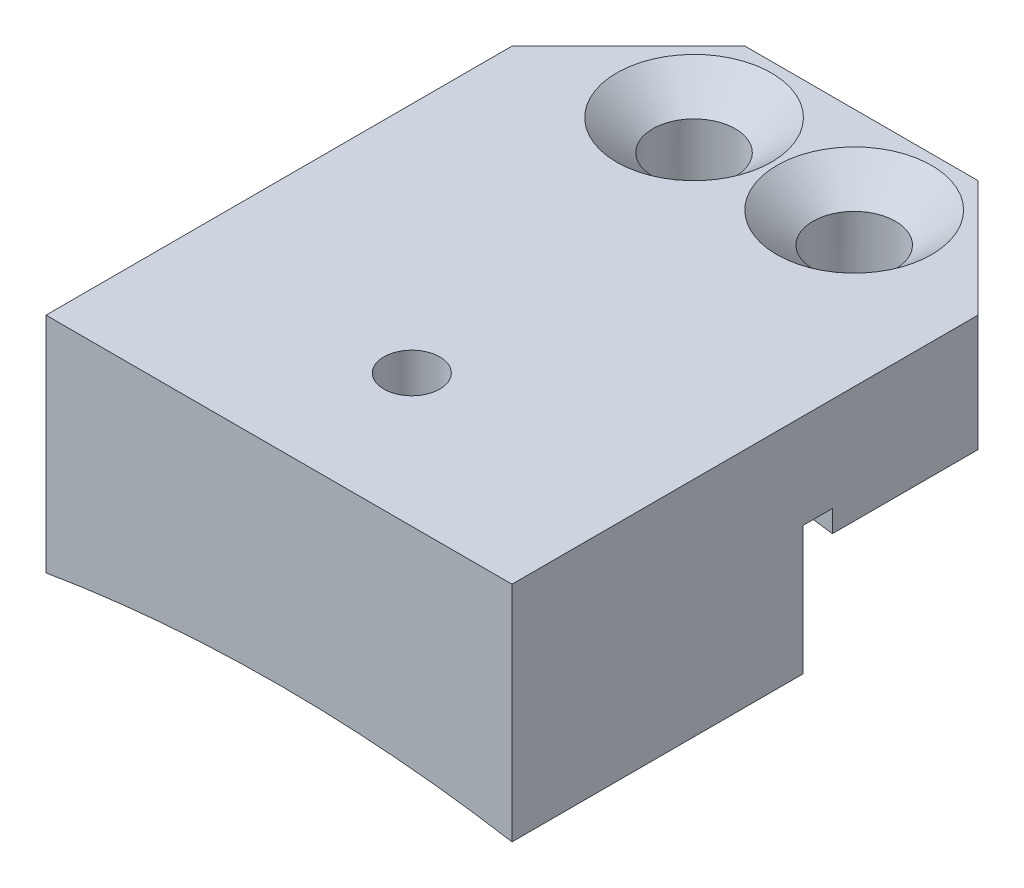
ISO-10303-21;
HEADER;
FILE_DESCRIPTION(('STEP AP214'),'2;1');
FILE_NAME('part.step','',(''),(''),'','','');
FILE_SCHEMA(('AUTOMOTIVE_DESIGN { 1 0 10303 214 1 1 1 1 }'));
ENDSEC;
DATA;
#1=APPLICATION_CONTEXT('core data for automotive mechanical design processes');
#2=APPLICATION_PROTOCOL_DEFINITION('international standard','automotive_design',2000,#1);
#3=PRODUCT_CONTEXT('',#1,'mechanical');
#4=PRODUCT('Part','Part','',(#3));
#5=PRODUCT_RELATED_PRODUCT_CATEGORY('part','',(#4));
#6=PRODUCT_DEFINITION_FORMATION('','',#4);
#7=PRODUCT_DEFINITION_CONTEXT('part definition',#1,'design');
#8=PRODUCT_DEFINITION('design','',#6,#7);
#9=PRODUCT_DEFINITION_SHAPE('','',#8);
#10=(LENGTH_UNIT() NAMED_UNIT(*) SI_UNIT(.MILLI.,.METRE.));
#11=(NAMED_UNIT(*) PLANE_ANGLE_UNIT() SI_UNIT($,.RADIAN.));
#12=(NAMED_UNIT(*) SI_UNIT($,.STERADIAN.) SOLID_ANGLE_UNIT());
#13=UNCERTAINTY_MEASURE_WITH_UNIT(LENGTH_MEASURE(1.E-05),#10,'distance_accuracy_value','');
#14=(GEOMETRIC_REPRESENTATION_CONTEXT(3) GLOBAL_UNCERTAINTY_ASSIGNED_CONTEXT((#13)) GLOBAL_UNIT_ASSIGNED_CONTEXT((#10,
#11,#12)) REPRESENTATION_CONTEXT('',''));
#15=CARTESIAN_POINT('',(0.,0.,0.));
#16=DIRECTION('',(0.,0.,1.));
#17=DIRECTION('',(1.,0.,0.));
#18=AXIS2_PLACEMENT_3D('',#15,#16,#17);
#19=CARTESIAN_POINT('',(-12.7,6.35,-15.875));
#20=DIRECTION('',(1.,0.,0.));
#21=DIRECTION('',(0.,0.,-1.));
#22=AXIS2_PLACEMENT_3D('',#19,#20,#21);
#23=PLANE('',#22);
#24=DIRECTION('',(0.,0.,1.));
#25=VECTOR('',#24,1.);
#26=CARTESIAN_POINT('',(-12.7,6.35,-15.875));
#27=LINE('',#26,#25);
#28=CARTESIAN_POINT('',(-12.7,6.35,-9.525));
#29=VERTEX_POINT('',#28);
#30=CARTESIAN_POINT('',(-12.7,6.35,15.875));
#31=VERTEX_POINT('',#30);
#32=EDGE_CURVE('E167',#29,#31,#27,.T.);
#33=ORIENTED_EDGE('',*,*,#32,.F.);
#34=DIRECTION('',(0.,-1.,0.));
#35=VECTOR('',#34,1.);
#36=CARTESIAN_POINT('',(-12.7,6.35,-9.525));
#37=LINE('',#36,#35);
#38=CARTESIAN_POINT('',(-12.7,0.,-9.525));
#39=VERTEX_POINT('',#38);
#40=EDGE_CURVE('E185',#29,#39,#37,.T.);
#41=ORIENTED_EDGE('',*,*,#40,.T.);
#42=DIRECTION('',(0.,0.,1.));
#43=VECTOR('',#42,1.);
#44=CARTESIAN_POINT('',(-12.7,0.,-15.875));
#45=LINE('',#44,#43);
#46=CARTESIAN_POINT('',(-12.7,0.,-1.5875));
#47=VERTEX_POINT('',#46);
#48=EDGE_CURVE('E166',#39,#47,#45,.T.);
#49=ORIENTED_EDGE('',*,*,#48,.T.);
#50=DIRECTION('',(0.,-1.,0.));
#51=VECTOR('',#50,1.);
#52=CARTESIAN_POINT('',(-12.7,0.,-1.5875));
#53=LINE('',#52,#51);
#54=CARTESIAN_POINT('',(-12.7,1.190625,-1.5875));
#55=VERTEX_POINT('',#54);
#56=EDGE_CURVE('E143',#55,#47,#53,.T.);
#57=ORIENTED_EDGE('',*,*,#56,.F.);
#58=DIRECTION('',(0.,0.,-1.));
#59=VECTOR('',#58,1.);
#60=CARTESIAN_POINT('',(-12.7,1.190625,0.));
#61=LINE('',#60,#59);
#62=CARTESIAN_POINT('',(-12.7,1.190625,0.));
#63=VERTEX_POINT('',#62);
#64=EDGE_CURVE('E147',#63,#55,#61,.T.);
#65=ORIENTED_EDGE('',*,*,#64,.F.);
#66=DIRECTION('',(0.,-1.,0.));
#67=VECTOR('',#66,1.);
#68=CARTESIAN_POINT('',(-12.7,6.35,0.));
#69=LINE('',#68,#67);
#70=CARTESIAN_POINT('',(-12.7,-5.81601314196502,0.));
#71=VERTEX_POINT('',#70);
#72=EDGE_CURVE('E134',#63,#71,#69,.T.);
#73=ORIENTED_EDGE('',*,*,#72,.T.);
#74=DIRECTION('',(0.,0.,1.));
#75=VECTOR('',#74,1.);
#76=CARTESIAN_POINT('',(-12.7,-5.81601314196502,0.));
#77=LINE('',#76,#75);
#78=CARTESIAN_POINT('',(-12.7,-5.81601314196502,15.875));
#79=VERTEX_POINT('',#78);
#80=EDGE_CURVE('E128',#71,#79,#77,.T.);
#81=ORIENTED_EDGE('',*,*,#80,.T.);
#82=DIRECTION('',(0.,-1.,0.));
#83=VECTOR('',#82,1.);
#84=CARTESIAN_POINT('',(-12.7,6.35,15.875));
#85=LINE('',#84,#83);
#86=EDGE_CURVE('E180',#31,#79,#85,.T.);
#87=ORIENTED_EDGE('',*,*,#86,.F.);
#88=EDGE_LOOP('',(#33,#41,#49,#57,#65,#73,#81,#87));
#89=FACE_BOUND('',#88,.T.);
#90=ADVANCED_FACE('F33',(#89),#23,.F.);
#91=CARTESIAN_POINT('',(-12.7,6.35,15.875));
#92=DIRECTION('',(0.,0.,-1.));
#93=DIRECTION('',(-1.,0.,0.));
#94=AXIS2_PLACEMENT_3D('',#91,#92,#93);
#95=PLANE('',#94);
#96=ORIENTED_EDGE('',*,*,#86,.T.);
#97=CARTESIAN_POINT('',(0.,-80.9502263873301,15.875));
#98=DIRECTION('',(0.,0.,-1.));
#99=DIRECTION('',(-1.,0.,0.));
#100=AXIS2_PLACEMENT_3D('',#97,#98,#99);
#101=CIRCLE('',#100,76.2);
#102=CARTESIAN_POINT('',(12.7,-5.816013141965,15.875));
#103=VERTEX_POINT('',#102);
#104=EDGE_CURVE('E155',#79,#103,#101,.T.);
#105=ORIENTED_EDGE('',*,*,#104,.T.);
#106=DIRECTION('',(0.,-1.,0.));
#107=VECTOR('',#106,1.);
#108=CARTESIAN_POINT('',(12.7,6.35,15.875));
#109=LINE('',#108,#107);
#110=CARTESIAN_POINT('',(12.7,6.35,15.875));
#111=VERTEX_POINT('',#110);
#112=EDGE_CURVE('E176',#111,#103,#109,.T.);
#113=ORIENTED_EDGE('',*,*,#112,.F.);
#114=DIRECTION('',(1.,0.,0.));
#115=VECTOR('',#114,1.);
#116=CARTESIAN_POINT('',(-12.7,6.35,15.875));
#117=LINE('',#116,#115);
#118=EDGE_CURVE('E169',#31,#111,#117,.T.);
#119=ORIENTED_EDGE('',*,*,#118,.F.);
#120=EDGE_LOOP('',(#96,#105,#113,#119));
#121=FACE_BOUND('',#120,.T.);
#122=ADVANCED_FACE('F236',(#121),#95,.F.);
#123=CARTESIAN_POINT('',(12.7,6.35,-15.875));
#124=DIRECTION('',(-1.,0.,0.));
#125=DIRECTION('',(0.,0.,1.));
#126=AXIS2_PLACEMENT_3D('',#123,#124,#125);
#127=PLANE('',#126);
#128=DIRECTION('',(0.,0.,-1.));
#129=VECTOR('',#128,1.);
#130=CARTESIAN_POINT('',(12.7,0.,-15.875));
#131=LINE('',#130,#129);
#132=CARTESIAN_POINT('',(12.7,0.,-1.5875));
#133=VERTEX_POINT('',#132);
#134=CARTESIAN_POINT('',(12.7,0.,-9.52499999999997));
#135=VERTEX_POINT('',#134);
#136=EDGE_CURVE('E170',#133,#135,#131,.T.);
#137=ORIENTED_EDGE('',*,*,#136,.T.);
#138=DIRECTION('',(0.,1.,0.));
#139=VECTOR('',#138,1.);
#140=CARTESIAN_POINT('',(12.7,6.35,-9.52499999999997));
#141=LINE('',#140,#139);
#142=CARTESIAN_POINT('',(12.7,6.35,-9.52499999999997));
#143=VERTEX_POINT('',#142);
#144=EDGE_CURVE('E11',#135,#143,#141,.T.);
#145=ORIENTED_EDGE('',*,*,#144,.T.);
#146=DIRECTION('',(0.,0.,-1.));
#147=VECTOR('',#146,1.);
#148=CARTESIAN_POINT('',(12.7,6.35,-15.875));
#149=LINE('',#148,#147);
#150=EDGE_CURVE('E172',#111,#143,#149,.T.);
#151=ORIENTED_EDGE('',*,*,#150,.F.);
#152=ORIENTED_EDGE('',*,*,#112,.T.);
#153=DIRECTION('',(0.,0.,1.));
#154=VECTOR('',#153,1.);
#155=CARTESIAN_POINT('',(12.7,-5.816013141965,0.));
#156=LINE('',#155,#154);
#157=CARTESIAN_POINT('',(12.7,-5.816013141965,0.));
#158=VERTEX_POINT('',#157);
#159=EDGE_CURVE('E124',#158,#103,#156,.T.);
#160=ORIENTED_EDGE('',*,*,#159,.F.);
#161=DIRECTION('',(0.,1.,0.));
#162=VECTOR('',#161,1.);
#163=CARTESIAN_POINT('',(12.7,6.35,0.));
#164=LINE('',#163,#162);
#165=CARTESIAN_POINT('',(12.7,1.190625,0.));
#166=VERTEX_POINT('',#165);
#167=EDGE_CURVE('E117',#158,#166,#164,.T.);
#168=ORIENTED_EDGE('',*,*,#167,.T.);
#169=DIRECTION('',(0.,0.,-1.));
#170=VECTOR('',#169,1.);
#171=CARTESIAN_POINT('',(12.7,1.190625,0.));
#172=LINE('',#171,#170);
#173=CARTESIAN_POINT('',(12.7,1.190625,-1.5875));
#174=VERTEX_POINT('',#173);
#175=EDGE_CURVE('E122',#166,#174,#172,.T.);
#176=ORIENTED_EDGE('',*,*,#175,.T.);
#177=DIRECTION('',(0.,-1.,0.));
#178=VECTOR('',#177,1.);
#179=CARTESIAN_POINT('',(12.7,0.,-1.5875));
#180=LINE('',#179,#178);
#181=EDGE_CURVE('E139',#174,#133,#180,.T.);
#182=ORIENTED_EDGE('',*,*,#181,.T.);
#183=EDGE_LOOP('',(#137,#145,#151,#152,#160,#168,#176,#182));
#184=FACE_BOUND('',#183,.T.);
#185=ADVANCED_FACE('F119',(#184),#127,.F.);
#186=CARTESIAN_POINT('',(-12.7,6.35,-15.875));
#187=DIRECTION('',(0.,0.,1.));
#188=DIRECTION('',(1.,0.,0.));
#189=AXIS2_PLACEMENT_3D('',#186,#187,#188);
#190=PLANE('',#189);
#191=CARTESIAN_POINT('',(0.,-80.9502263873301,-15.875));
#192=DIRECTION('',(0.,0.,1.));
#193=DIRECTION('',(-1.,0.,0.));
#194=AXIS2_PLACEMENT_3D('',#191,#192,#193);
#195=CIRCLE('',#194,81.9404);
#196=CARTESIAN_POINT('',(6.34999999999999,0.743755350371952,-15.875));
#197=VERTEX_POINT('',#196);
#198=CARTESIAN_POINT('',(-6.34999999999999,0.743755350371952,-15.875));
#199=VERTEX_POINT('',#198);
#200=EDGE_CURVE('E162',#197,#199,#195,.T.);
#201=ORIENTED_EDGE('',*,*,#200,.T.);
#202=DIRECTION('',(0.,1.,0.));
#203=VECTOR('',#202,1.);
#204=CARTESIAN_POINT('',(-6.34999999999999,6.35,-15.875));
#205=LINE('',#204,#203);
#206=CARTESIAN_POINT('',(-6.34999999999999,6.35,-15.875));
#207=VERTEX_POINT('',#206);
#208=EDGE_CURVE('E60',#199,#207,#205,.T.);
#209=ORIENTED_EDGE('',*,*,#208,.T.);
#210=DIRECTION('',(-1.,0.,0.));
#211=VECTOR('',#210,1.);
#212=CARTESIAN_POINT('',(-12.7,6.35,-15.875));
#213=LINE('',#212,#211);
#214=CARTESIAN_POINT('',(6.34999999999999,6.35,-15.875));
#215=VERTEX_POINT('',#214);
#216=EDGE_CURVE('E174',#215,#207,#213,.T.);
#217=ORIENTED_EDGE('',*,*,#216,.F.);
#218=DIRECTION('',(0.,-1.,0.));
#219=VECTOR('',#218,1.);
#220=CARTESIAN_POINT('',(6.34999999999999,6.35,-15.875));
#221=LINE('',#220,#219);
#222=EDGE_CURVE('E192',#215,#197,#221,.T.);
#223=ORIENTED_EDGE('',*,*,#222,.T.);
#224=EDGE_LOOP('',(#201,#209,#217,#223));
#225=FACE_BOUND('',#224,.T.);
#226=ADVANCED_FACE('F264',(#225),#190,.F.);
#227=CARTESIAN_POINT('',(0.,6.35,0.));
#228=DIRECTION('',(0.,1.,0.));
#229=DIRECTION('',(0.,0.,1.));
#230=AXIS2_PLACEMENT_3D('',#227,#228,#229);
#231=PLANE('',#230);
#232=CARTESIAN_POINT('',(-4.365625,6.35,-11.1125));
#233=DIRECTION('',(0.,1.,0.));
#234=DIRECTION('',(0.,0.,1.));
#235=AXIS2_PLACEMENT_3D('',#232,#233,#234);
#236=CIRCLE('',#235,4.2164);
#237=CARTESIAN_POINT('',(-4.365625,6.35,-6.8961));
#238=VERTEX_POINT('',#237);
#239=EDGE_CURVE('E397',#238,#238,#236,.T.);
#240=ORIENTED_EDGE('',*,*,#239,.F.);
#241=EDGE_LOOP('',(#240));
#242=FACE_BOUND('',#241,.T.);
#243=CARTESIAN_POINT('',(4.365625,6.35,-11.1125));
#244=DIRECTION('',(0.,1.,0.));
#245=DIRECTION('',(0.,0.,1.));
#246=AXIS2_PLACEMENT_3D('',#243,#244,#245);
#247=CIRCLE('',#246,4.2164);
#248=CARTESIAN_POINT('',(4.365625,6.35,-6.89609999999999));
#249=VERTEX_POINT('',#248);
#250=EDGE_CURVE('E401',#249,#249,#247,.T.);
#251=ORIENTED_EDGE('',*,*,#250,.F.);
#252=EDGE_LOOP('',(#251));
#253=FACE_BOUND('',#252,.T.);
#254=CARTESIAN_POINT('',(0.,6.35,8.636));
#255=DIRECTION('',(0.,1.,0.));
#256=DIRECTION('',(0.,0.,1.));
#257=AXIS2_PLACEMENT_3D('',#254,#255,#256);
#258=CIRCLE('',#257,1.524);
#259=CARTESIAN_POINT('',(0.,6.35,10.16));
#260=VERTEX_POINT('',#259);
#261=EDGE_CURVE('E150',#260,#260,#258,.T.);
#262=ORIENTED_EDGE('',*,*,#261,.F.);
#263=EDGE_LOOP('',(#262));
#264=FACE_BOUND('',#263,.T.);
#265=ORIENTED_EDGE('',*,*,#216,.T.);
#266=DIRECTION('',(0.707106781186549,0.,-0.707106781186547));
#267=VECTOR('',#266,1.);
#268=CARTESIAN_POINT('',(-11.1125,6.35,-11.1125));
#269=LINE('',#268,#267);
#270=EDGE_CURVE('E46',#207,#29,#269,.F.);
#271=ORIENTED_EDGE('',*,*,#270,.T.);
#272=ORIENTED_EDGE('',*,*,#32,.T.);
#273=ORIENTED_EDGE('',*,*,#118,.T.);
#274=ORIENTED_EDGE('',*,*,#150,.T.);
#275=DIRECTION('',(0.707106781186547,0.,0.707106781186548));
#276=VECTOR('',#275,1.);
#277=CARTESIAN_POINT('',(11.1125,6.35,-11.1125));
#278=LINE('',#277,#276);
#279=EDGE_CURVE('E196',#143,#215,#278,.F.);
#280=ORIENTED_EDGE('',*,*,#279,.T.);
#281=EDGE_LOOP('',(#265,#271,#272,#273,#274,#280));
#282=FACE_BOUND('',#281,.T.);
#283=ADVANCED_FACE('F233',(#242,#253,#264,#282),#231,.T.);
#284=CARTESIAN_POINT('',(0.,-80.9502263873301,-15.875));
#285=DIRECTION('',(0.,0.,1.));
#286=DIRECTION('',(1.,0.,0.));
#287=AXIS2_PLACEMENT_3D('',#284,#285,#286);
#288=CYLINDRICAL_SURFACE('',#287,81.9404);
#289=CARTESIAN_POINT('',(-4.365625,0.873794966544772,-8.8646));
#290=CARTESIAN_POINT('',(-4.2393676004952,0.88053086701709,-8.86460555100744));
#291=CARTESIAN_POINT('',(-4.11300428141314,0.886977053246546,-8.87527256676646));
#292=CARTESIAN_POINT('',(-3.86372496147606,0.899125512881899,-8.9176944765974));
#293=CARTESIAN_POINT('',(-3.74081320193417,0.904826899995742,-8.94947422561914));
#294=CARTESIAN_POINT('',(-3.50208341492095,0.915388102013105,-9.03323607945619));
#295=CARTESIAN_POINT('',(-3.38626245711803,0.920248266096979,-9.0852097728278));
#296=CARTESIAN_POINT('',(-3.16500607809933,0.929100452897192,-9.20788249008404));
#297=CARTESIAN_POINT('',(-3.059568108371,0.933092688939154,-9.27857690315836));
#298=CARTESIAN_POINT('',(-2.86213267134413,0.940231645230061,-9.4366295372973));
#299=CARTESIAN_POINT('',(-2.77012433387053,0.943379051050038,-9.52397414785202));
#300=CARTESIAN_POINT('',(-2.60206833462068,0.948891317273969,-9.71289073410724));
#301=CARTESIAN_POINT('',(-2.52602123421135,0.95125615015602,-9.81446321000145));
#302=CARTESIAN_POINT('',(-2.39210447004557,0.955277031755266,-10.0288775465579));
#303=CARTESIAN_POINT('',(-2.33422305456733,0.956933538954102,-10.1417120590597));
#304=CARTESIAN_POINT('',(-2.23821891558132,0.959613363122238,-10.3755018270361));
#305=CARTESIAN_POINT('',(-2.20009613191043,0.960636682019538,-10.4964570577827));
#306=CARTESIAN_POINT('',(-2.14469852046286,0.962105995204031,-10.7430343812931));
#307=CARTESIAN_POINT('',(-2.12742042604676,0.962552079952271,-10.8686557396314));
#308=CARTESIAN_POINT('',(-2.11419276347216,0.962894582001233,-11.121016935195));
#309=CARTESIAN_POINT('',(-2.11824315487865,0.962791000344024,-11.2477567702993));
#310=CARTESIAN_POINT('',(-2.14755701458351,0.962027650238026,-11.4987558862599));
#311=CARTESIAN_POINT('',(-2.17282024835024,0.961367887938433,-11.6230151945256));
#312=CARTESIAN_POINT('',(-2.2438408165076,0.959453028275793,-11.8655274287162));
#313=CARTESIAN_POINT('',(-2.28959816431249,0.958197930523073,-11.9837803507095));
#314=CARTESIAN_POINT('',(-2.40030481417248,0.955028267887674,-12.2109231527883));
#315=CARTESIAN_POINT('',(-2.46525413192047,0.953113702465762,-12.3198130252176));
#316=CARTESIAN_POINT('',(-2.61249536404737,0.94854910357247,-12.5251395902006));
#317=CARTESIAN_POINT('',(-2.69478725824728,0.945899070956845,-12.6215762972439));
#318=CARTESIAN_POINT('',(-2.87437634032377,0.939792334681709,-12.7992690103353));
#319=CARTESIAN_POINT('',(-2.97167458961141,0.936335573952815,-12.880523941665));
#320=CARTESIAN_POINT('',(-3.17850090285624,0.928568030750591,-13.0255454717755));
#321=CARTESIAN_POINT('',(-3.28802897606332,0.924257247631329,-13.0893120573291));
#322=CARTESIAN_POINT('',(-3.51624457005988,0.914773518299343,-13.1975815144952));
#323=CARTESIAN_POINT('',(-3.63493578302122,0.909600223564542,-13.2420765726498));
#324=CARTESIAN_POINT('',(-3.87806478763074,0.898442294680138,-13.3105192920188));
#325=CARTESIAN_POINT('',(-4.00250260865787,0.892457656382321,-13.3344668481741));
#326=CARTESIAN_POINT('',(-4.25372841416307,0.879785086402275,-13.3611678527169));
#327=CARTESIAN_POINT('',(-4.38051872531358,0.873096424118641,-13.3638990595983));
#328=CARTESIAN_POINT('',(-4.63273149978262,0.85920402935681,-13.3480479551384));
#329=CARTESIAN_POINT('',(-4.75815394984174,0.852000291890821,-13.3294654373769));
#330=CARTESIAN_POINT('',(-5.00426738746022,0.837313539826973,-13.2714805571284));
#331=CARTESIAN_POINT('',(-5.12495120179245,0.829830132944277,-13.2320478456645));
#332=CARTESIAN_POINT('',(-5.35797921941361,0.814893659690856,-13.1334633959538));
#333=CARTESIAN_POINT('',(-5.47032336216963,0.807440593540727,-13.0743115145939));
#334=CARTESIAN_POINT('',(-5.68357217305668,0.792893244775783,-12.9379046476585));
#335=CARTESIAN_POINT('',(-5.78446808168841,0.785799239160747,-12.8606359369457));
#336=CARTESIAN_POINT('',(-5.97185059382775,0.772322493147688,-12.6901988677932));
#337=CARTESIAN_POINT('',(-6.05833724871893,0.76593975021332,-12.5970305660542));
#338=CARTESIAN_POINT('',(-6.21433953347619,0.754224329931612,-12.397538715688));
#339=CARTESIAN_POINT('',(-6.28387392708934,0.748890492871065,-12.2912299100354));
#340=CARTESIAN_POINT('',(-6.40409491667334,0.739554933290749,-12.0683880022471));
#341=CARTESIAN_POINT('',(-6.45478183372198,0.73555318807814,-11.9518550743271));
#342=CARTESIAN_POINT('',(-6.53572881390687,0.729116513577971,-11.7122128511949));
#343=CARTESIAN_POINT('',(-6.56604432122154,0.726677332365424,-11.589122398246));
#344=CARTESIAN_POINT('',(-6.60559104861619,0.723488595049044,-11.3395788219803));
#345=CARTESIAN_POINT('',(-6.61482256866144,0.722739014906987,-11.2131257465302));
#346=CARTESIAN_POINT('',(-6.61193693317463,0.722972664101826,-10.9607660678989));
#347=CARTESIAN_POINT('',(-6.59987030897731,0.723951791959856,-10.8348588798201));
#348=CARTESIAN_POINT('',(-6.5548359531432,0.727578316414996,-10.5868651171106));
#349=CARTESIAN_POINT('',(-6.52186823226487,0.730225712153395,-10.4647785405134));
#350=CARTESIAN_POINT('',(-6.43598243626212,0.737037769158496,-10.2278819315692));
#351=CARTESIAN_POINT('',(-6.38306410680883,0.74120244976741,-10.1130719920061));
#352=CARTESIAN_POINT('',(-6.25879612448698,0.750816996785705,-9.89396830166772));
#353=CARTESIAN_POINT('',(-6.18744696276357,0.756266828948008,-9.78967427076733));
#354=CARTESIAN_POINT('',(-6.02816731937746,0.768172552702588,-9.59430069009262));
#355=CARTESIAN_POINT('',(-5.94019987869242,0.774630681078725,-9.50325141120484));
#356=CARTESIAN_POINT('',(-5.75025609028221,0.78821471197738,-9.33717805869996));
#357=CARTESIAN_POINT('',(-5.64827607989202,0.795340788935843,-9.26215818806009));
#358=CARTESIAN_POINT('',(-5.43287186745753,0.809939574048783,-9.13006246996541));
#359=CARTESIAN_POINT('',(-5.31941199903875,0.817413320940975,-9.07304496395701));
#360=CARTESIAN_POINT('',(-5.08461458650422,0.832348944257043,-8.97894219193045));
#361=CARTESIAN_POINT('',(-4.96328652091035,0.839810824263939,-8.94183342478459));
#362=CARTESIAN_POINT('',(-4.76193908363991,0.851724726949964,-8.89837544433087));
#363=CARTESIAN_POINT('',(-4.68322905405247,0.856269707585743,-8.88572649760992));
#364=CARTESIAN_POINT('',(-4.52490173822254,0.86517989012167,-8.86883701923103));
#365=CARTESIAN_POINT('',(-4.44528445088656,0.869545091805106,-8.86459649770859));
#366=CARTESIAN_POINT('',(-4.365625,0.873794966544772,-8.8646));
#367=B_SPLINE_CURVE_WITH_KNOTS('',3,(#289,#290,#291,#292,#293,#294,#295,#296,#297,#298,#299,
#300,#301,#302,#303,#304,#305,#306,#307,#308,#309,#310,#311,#312,#313,#314,#315,#316,#317,#318,
#319,#320,#321,#322,#323,#324,#325,#326,#327,#328,#329,#330,#331,#332,#333,#334,#335,#336,#337,
#338,#339,#340,#341,#342,#343,#344,#345,#346,#347,#348,#349,#350,#351,#352,#353,#354,#355,#356,
#357,#358,#359,#360,#361,#362,#363,#364,#365,#366),.UNSPECIFIED.,.T.,.F.,(4,2,2,2,2,2,2,2,2,2,2,
2,2,2,2,2,2,2,2,2,2,2,2,2,2,2,2,2,2,2,2,2,2,2,2,2,2,2,4),(0.,0.379020324942433,
0.758487643850816,1.13779707126402,1.51701316360041,1.89592058921729,2.27484133901821,
2.65351645018162,3.03219040830953,3.41080501549127,3.78941890488725,4.16802860833943,
4.54663855960818,4.92524882045946,5.30385864077977,5.68249525275574,6.06113215111113,
6.43992242082539,6.81871462728096,7.19790387535936,7.57709679585874,7.95684318488967,
8.33659233001345,8.71663010439351,9.09666652352476,9.47628036680558,9.8558877428464,
10.2344577238585,10.613022318861,10.990689949858,11.3683573864575,11.7460296376963,
12.1236918257565,12.5022040384372,12.8808153771254,13.2606414031287,13.6400180741621,
13.8791526887207,14.1182875915318),.UNSPECIFIED.);
#368=CARTESIAN_POINT('',(-4.365625,0.873794966544772,-8.8646));
#369=VERTEX_POINT('',#368);
#370=EDGE_CURVE('E37',#369,#369,#367,.T.);
#371=ORIENTED_EDGE('',*,*,#370,.T.);
#372=EDGE_LOOP('',(#371));
#373=FACE_BOUND('',#372,.T.);
#374=CARTESIAN_POINT('',(4.365625,0.873794966544772,-8.8646));
#375=CARTESIAN_POINT('',(4.49211455115411,0.86704584359814,-8.86460559792831));
#376=CARTESIAN_POINT('',(4.61868005454019,0.859996209660592,-8.87531204196265));
#377=CARTESIAN_POINT('',(4.86829378177957,0.845522594294208,-8.91785998424808));
#378=CARTESIAN_POINT('',(4.99133754947122,0.838098168829695,-8.94972712275821));
#379=CARTESIAN_POINT('',(5.23025955910051,0.823166952819362,-9.03368318148522));
#380=CARTESIAN_POINT('',(5.34614133800712,0.815660205120565,-9.08576202607634));
#381=CARTESIAN_POINT('',(5.56747907232003,0.800887659818462,-9.20865569748867));
#382=CARTESIAN_POINT('',(5.67293761367331,0.793621802750319,-9.27946586106603));
#383=CARTESIAN_POINT('',(5.87049554684862,0.779671814838225,-9.43785064236939));
#384=CARTESIAN_POINT('',(5.96259184894793,0.772987818679222,-9.52542912657445));
#385=CARTESIAN_POINT('',(6.13076916010635,0.760543718877466,-9.71487202717574));
#386=CARTESIAN_POINT('',(6.20684966614536,0.754783644254361,-9.81673689210764));
#387=CARTESIAN_POINT('',(6.34068629920714,0.744506389298695,-10.0316732987345));
#388=CARTESIAN_POINT('',(6.39847455270441,0.739987031782881,-10.1447247298903));
#389=CARTESIAN_POINT('',(6.49424059005345,0.732429743267113,-10.3789741487204));
#390=CARTESIAN_POINT('',(6.53221876483975,0.72939178303316,-10.5001719755794));
#391=CARTESIAN_POINT('',(6.58718282415219,0.724977564418375,-10.7468999068086));
#392=CARTESIAN_POINT('',(6.60422882985346,0.723596547245038,-10.8724165341902));
#393=CARTESIAN_POINT('',(6.61703369644104,0.722560149727397,-11.1245370807647));
#394=CARTESIAN_POINT('',(6.6127928687977,0.722904744133827,-11.2511409840214));
#395=CARTESIAN_POINT('',(6.58317441827439,0.725297376240444,-11.5016063372311));
#396=CARTESIAN_POINT('',(6.5578342312391,0.727342396925764,-11.6254722458206));
#397=CARTESIAN_POINT('',(6.48679795739544,0.733014632131031,-11.8671837543513));
#398=CARTESIAN_POINT('',(6.44110179383931,0.736641852616314,-11.9850293315925));
#399=CARTESIAN_POINT('',(6.33061848638139,0.745278258233042,-12.2114720167708));
#400=CARTESIAN_POINT('',(6.26581499385995,0.750288626578997,-12.3200611016749));
#401=CARTESIAN_POINT('',(6.11898227049606,0.76141666962061,-12.5248263056644));
#402=CARTESIAN_POINT('',(6.0369527889046,0.767534360434758,-12.6210022440258));
#403=CARTESIAN_POINT('',(5.85774737834116,0.780575772401567,-12.7984931460028));
#404=CARTESIAN_POINT('',(5.76053062185444,0.787501653104447,-12.8797667291239));
#405=CARTESIAN_POINT('',(5.55386682877297,0.801803719270774,-13.0248483170913));
#406=CARTESIAN_POINT('',(5.44441961430592,0.809179911282566,-13.0886560678788));
#407=CARTESIAN_POINT('',(5.21610958221049,0.824063309380128,-13.1971442855463));
#408=CARTESIAN_POINT('',(5.09722496123406,0.831570785650409,-13.241778837112));
#409=CARTESIAN_POINT('',(4.85363334731007,0.846388913844704,-13.3104342629943));
#410=CARTESIAN_POINT('',(4.72892633122029,0.853699564986216,-13.3344550553701));
#411=CARTESIAN_POINT('',(4.47716134724327,0.867865000000928,-13.3611989037966));
#412=CARTESIAN_POINT('',(4.35010226975968,0.8747195613248,-13.3639116370427));
#413=CARTESIAN_POINT('',(4.09730458698441,0.887767653606669,-13.3479191721176));
#414=CARTESIAN_POINT('',(3.97156597456223,0.893961188135861,-13.3292140896625));
#415=CARTESIAN_POINT('',(3.7251321932174,0.905547692523442,-13.2709339268572));
#416=CARTESIAN_POINT('',(3.60443154620389,0.91094154912402,-13.2313821879871));
#417=CARTESIAN_POINT('',(3.3713686863988,0.920871341106741,-13.1325323743287));
#418=CARTESIAN_POINT('',(3.25900640953653,0.925407283081374,-13.0732344512861));
#419=CARTESIAN_POINT('',(3.04598303348644,0.933609032552492,-12.9366667866793));
#420=CARTESIAN_POINT('',(2.94530562621476,0.937276060391668,-12.85942255555));
#421=CARTESIAN_POINT('',(2.75834142004522,0.943787274131939,-12.6891053884436));
#422=CARTESIAN_POINT('',(2.67205456001304,0.946631463528677,-12.5960325197134));
#423=CARTESIAN_POINT('',(2.51639987256294,0.951562121338417,-12.3967856134726));
#424=CARTESIAN_POINT('',(2.44701792996266,0.953649222617794,-12.2906226182262));
#425=CARTESIAN_POINT('',(2.32705610973175,0.957145558322601,-12.0681477675417));
#426=CARTESIAN_POINT('',(2.27647618239035,0.958554794540246,-11.9518359389372));
#427=CARTESIAN_POINT('',(2.1955695187846,0.960763569329827,-11.7123987125216));
#428=CARTESIAN_POINT('',(2.16523739664678,0.961563270044953,-11.5892751360646));
#429=CARTESIAN_POINT('',(2.12566766461132,0.962599756522179,-11.3396811587358));
#430=CARTESIAN_POINT('',(2.1164300866353,0.962836541432439,-11.2132107527998));
#431=CARTESIAN_POINT('',(2.11931227688429,0.962762016623957,-10.9605181016692));
#432=CARTESIAN_POINT('',(2.13143130646554,0.962450725861068,-10.8342958480432));
#433=CARTESIAN_POINT('',(2.1766806190485,0.961260713119226,-10.5856779324878));
#434=CARTESIAN_POINT('',(2.20981093959761,0.960381990126264,-10.4632822773971));
#435=CARTESIAN_POINT('',(2.2961409751215,0.958007271109295,-10.2257900776505));
#436=CARTESIAN_POINT('',(2.34934105652283,0.956511263815082,-10.1106936663065));
#437=CARTESIAN_POINT('',(2.47429404262609,0.952831618252519,-9.89107368129428));
#438=CARTESIAN_POINT('',(2.54604620961697,0.950648007325507,-9.78654968745093));
#439=CARTESIAN_POINT('',(2.70605417346755,0.945517162978764,-9.59104173928841));
#440=CARTESIAN_POINT('',(2.79430876389578,0.942569985374515,-9.50005679605169));
#441=CARTESIAN_POINT('',(2.98483973024476,0.935846607516869,-9.33417421464631));
#442=CARTESIAN_POINT('',(3.08711956089247,0.932070202868262,-9.25928055181933));
#443=CARTESIAN_POINT('',(3.30283495382704,0.923652753144639,-9.12767917874036));
#444=CARTESIAN_POINT('',(3.41627867234902,0.919011073660214,-9.07098489561685));
#445=CARTESIAN_POINT('',(3.65094762346188,0.908881044253842,-8.97750426220427));
#446=CARTESIAN_POINT('',(3.77216342564212,0.903393709482643,-8.94069427778857));
#447=CARTESIAN_POINT('',(3.97272497115704,0.893848672500045,-8.89779084117816));
#448=CARTESIAN_POINT('',(4.05078292989932,0.890023395882808,-8.88535876193946));
#449=CARTESIAN_POINT('',(4.20775906332331,0.882102756980521,-8.8687615952689));
#450=CARTESIAN_POINT('',(4.28667723782257,0.878007394752757,-8.86459650608363));
#451=CARTESIAN_POINT('',(4.365625,0.873794966544772,-8.8646));
#452=B_SPLINE_CURVE_WITH_KNOTS('',3,(#374,#375,#376,#377,#378,#379,#380,#381,#382,#383,#384,
#385,#386,#387,#388,#389,#390,#391,#392,#393,#394,#395,#396,#397,#398,#399,#400,#401,#402,#403,
#404,#405,#406,#407,#408,#409,#410,#411,#412,#413,#414,#415,#416,#417,#418,#419,#420,#421,#422,
#423,#424,#425,#426,#427,#428,#429,#430,#431,#432,#433,#434,#435,#436,#437,#438,#439,#440,#441,
#442,#443,#444,#445,#446,#447,#448,#449,#450,#451),.UNSPECIFIED.,.T.,.F.,(4,2,2,2,2,2,2,2,2,2,2,
2,2,2,2,2,2,2,2,2,2,2,2,2,2,2,2,2,2,2,2,2,2,2,2,2,2,2,4),(0.,0.379719649182271,
0.759900243522707,1.13989155907315,1.51978836300818,1.89977287017178,2.27976931001318,
2.65909461515717,3.03841243436565,3.41663821293011,3.79485845728576,4.17240906528924,
4.54996109677674,4.92783711156277,5.30571862725799,5.68463404946849,6.06355498311024,
6.44337835204397,6.82320323078648,7.20321210640328,7.58321892891975,7.96280116834529,
8.34238049082075,8.72142351243384,9.10046492374511,9.47918875196452,9.8579115788666,
10.2365336261106,10.6151562463092,10.9937657716495,11.3723759735709,11.7509930883573,
12.129595150007,12.5081695442666,12.8868373578475,13.2657839060775,13.6442790485066,
13.8812790429129,14.1182789870522),.UNSPECIFIED.);
#453=CARTESIAN_POINT('',(4.365625,0.873794966544772,-8.8646));
#454=VERTEX_POINT('',#453);
#455=EDGE_CURVE('E204',#454,#454,#452,.T.);
#456=ORIENTED_EDGE('',*,*,#455,.T.);
#457=EDGE_LOOP('',(#456));
#458=FACE_BOUND('',#457,.T.);
#459=ORIENTED_EDGE('',*,*,#48,.F.);
#460=CARTESIAN_POINT('',(0.,-80.9502263873301,-22.225));
#461=DIRECTION('',(0.707106781186547,0.,0.707106781186549));
#462=DIRECTION('',(-0.707106781186549,0.,0.707106781186547));
#463=AXIS2_PLACEMENT_3D('',#460,#461,#462);
#464=ELLIPSE('',#463,115.881224986276,81.9404);
#465=EDGE_CURVE('E190',#39,#199,#464,.F.);
#466=ORIENTED_EDGE('',*,*,#465,.T.);
#467=ORIENTED_EDGE('',*,*,#200,.F.);
#468=CARTESIAN_POINT('',(0.,-80.9502263873301,-22.225));
#469=DIRECTION('',(-0.707106781186548,0.,0.707106781186547));
#470=DIRECTION('',(0.707106781186547,0.,0.707106781186548));
#471=AXIS2_PLACEMENT_3D('',#468,#469,#470);
#472=ELLIPSE('',#471,115.881224986277,81.9404);
#473=EDGE_CURVE('E188',#197,#135,#472,.F.);
#474=ORIENTED_EDGE('',*,*,#473,.T.);
#475=ORIENTED_EDGE('',*,*,#136,.F.);
#476=CARTESIAN_POINT('',(0.,-80.9502263873301,-1.5875));
#477=DIRECTION('',(0.,0.,-1.));
#478=DIRECTION('',(-1.,0.,0.));
#479=AXIS2_PLACEMENT_3D('',#476,#477,#478);
#480=CIRCLE('',#479,81.9404);
#481=EDGE_CURVE('E182',#133,#47,#480,.F.);
#482=ORIENTED_EDGE('',*,*,#481,.T.);
#483=EDGE_LOOP('',(#459,#466,#467,#474,#475,#482));
#484=FACE_BOUND('',#483,.T.);
#485=ADVANCED_FACE('F226',(#373,#458,#484),#288,.F.);
#486=CARTESIAN_POINT('',(0.,-80.9502263873301,0.));
#487=DIRECTION('',(0.,0.,-1.));
#488=DIRECTION('',(-1.,0.,0.));
#489=AXIS2_PLACEMENT_3D('',#486,#487,#488);
#490=PLANE('',#489);
#491=ORIENTED_EDGE('',*,*,#72,.F.);
#492=DIRECTION('',(-1.,0.,0.));
#493=VECTOR('',#492,1.);
#494=CARTESIAN_POINT('',(12.7,1.190625,0.));
#495=LINE('',#494,#493);
#496=EDGE_CURVE('E132',#166,#63,#495,.T.);
#497=ORIENTED_EDGE('',*,*,#496,.F.);
#498=ORIENTED_EDGE('',*,*,#167,.F.);
#499=CARTESIAN_POINT('',(0.,-80.9502263873301,0.));
#500=DIRECTION('',(0.,0.,-1.));
#501=DIRECTION('',(-1.,0.,0.));
#502=AXIS2_PLACEMENT_3D('',#499,#500,#501);
#503=CIRCLE('',#502,76.2);
#504=EDGE_CURVE('E129',#71,#158,#503,.T.);
#505=ORIENTED_EDGE('',*,*,#504,.F.);
#506=EDGE_LOOP('',(#491,#497,#498,#505));
#507=FACE_BOUND('',#506,.T.);
#508=ADVANCED_FACE('F133',(#507),#490,.T.);
#509=CARTESIAN_POINT('',(0.,-80.9502263873301,0.));
#510=DIRECTION('',(0.,0.,1.));
#511=DIRECTION('',(1.,0.,0.));
#512=AXIS2_PLACEMENT_3D('',#509,#510,#511);
#513=CYLINDRICAL_SURFACE('',#512,76.2);
#514=CARTESIAN_POINT('',(0.,-4.75022638733014,10.16));
#515=CARTESIAN_POINT('',(-0.0855945656827698,-4.75022659308966,10.1599962070736));
#516=CARTESIAN_POINT('',(-0.171250977614999,-4.75037215633138,10.1527647471407));
#517=CARTESIAN_POINT('',(-0.340204149372332,-4.7509388435013,10.1240177212897));
#518=CARTESIAN_POINT('',(-0.423497953453263,-4.7513602979803,10.1024850203172));
#519=CARTESIAN_POINT('',(-0.58525379323911,-4.75243103058978,10.0457493092276));
#520=CARTESIAN_POINT('',(-0.663718140465757,-4.75308019871716,10.0105528988513));
#521=CARTESIAN_POINT('',(-0.813602412223302,-4.75453309855577,9.92749811049742));
#522=CARTESIAN_POINT('',(-0.885024068216507,-4.75533679213249,9.87964285543502));
#523=CARTESIAN_POINT('',(-1.01883792754715,-4.75700847572435,9.77261206815792));
#524=CARTESIAN_POINT('',(-1.08122805451763,-4.75787648045562,9.71343394002904));
#525=CARTESIAN_POINT('',(-1.19519063595497,-4.7595788241602,9.58544098104737));
#526=CARTESIAN_POINT('',(-1.24676266294491,-4.76041316180211,9.51662576956461));
#527=CARTESIAN_POINT('',(-1.33762539343413,-4.76195412030745,9.37130813195186));
#528=CARTESIAN_POINT('',(-1.37691529623936,-4.76266073284299,9.29480520507515));
#529=CARTESIAN_POINT('',(-1.44209308403132,-4.76386647789293,9.13628743659068));
#530=CARTESIAN_POINT('',(-1.46798100787017,-4.76436561100882,9.05427261096262));
#531=CARTESIAN_POINT('',(-1.50561673298404,-4.76510004184217,8.8870707058181));
#532=CARTESIAN_POINT('',(-1.51736642442724,-4.76533537482731,8.80188405191989));
#533=CARTESIAN_POINT('',(-1.52639796018199,-4.76551577804419,8.63074711250527));
#534=CARTESIAN_POINT('',(-1.5236798446417,-4.76546084908141,8.5447968291086));
#535=CARTESIAN_POINT('',(-1.50385456941548,-4.76506695554977,8.37458528727608));
#536=CARTESIAN_POINT('',(-1.48674946519336,-4.76472803155522,8.29032378932464));
#537=CARTESIAN_POINT('',(-1.43863893508377,-4.76380442076428,8.12586857602597));
#538=CARTESIAN_POINT('',(-1.40763348743569,-4.76321973358317,8.04567486704697));
#539=CARTESIAN_POINT('',(-1.33260005250313,-4.76187046514891,7.89162511173705));
#540=CARTESIAN_POINT('',(-1.28857112242157,-4.76110587087273,7.81776952473556));
#541=CARTESIAN_POINT('',(-1.18874127415744,-4.75948300013029,7.67849758719931));
#542=CARTESIAN_POINT('',(-1.13294034666323,-4.75862472358992,7.61308124334005));
#543=CARTESIAN_POINT('',(-1.01113884685324,-4.75691106645239,7.49253273100536));
#544=CARTESIAN_POINT('',(-0.94513648839625,-4.75605568638922,7.43740236721262));
#545=CARTESIAN_POINT('',(-0.804812021892296,-4.75444440038873,7.33900467492366));
#546=CARTESIAN_POINT('',(-0.730489912653461,-4.75368849446568,7.29573734812694));
#547=CARTESIAN_POINT('',(-0.575634728424777,-4.75236136977959,7.22229416585723));
#548=CARTESIAN_POINT('',(-0.495101627585207,-4.75179015178528,7.19211836487374));
#549=CARTESIAN_POINT('',(-0.330110981762136,-4.7508968119872,7.14571597017578));
#550=CARTESIAN_POINT('',(-0.24565344162392,-4.75057468987589,7.12948935923951));
#551=CARTESIAN_POINT('',(-0.0752270720525427,-4.75021589455247,7.11144817090589));
#552=CARTESIAN_POINT('',(0.0107414930212531,-4.75017917189723,7.10963109717198));
#553=CARTESIAN_POINT('',(0.181763310555559,-4.75039518450232,7.12045406171233));
#554=CARTESIAN_POINT('',(0.266816563464205,-4.75064791962095,7.13309409290806));
#555=CARTESIAN_POINT('',(0.433586420342392,-4.7514143265968,7.17247039282237));
#556=CARTESIAN_POINT('',(0.515303291490025,-4.7519279775154,7.19920553040718));
#557=CARTESIAN_POINT('',(0.673088896335951,-4.75315831899497,7.26601196859382));
#558=CARTESIAN_POINT('',(0.749157625388497,-4.75387500972296,7.30608328016487));
#559=CARTESIAN_POINT('',(0.893499101504723,-4.75543078165643,7.3984310085347));
#560=CARTESIAN_POINT('',(0.961770772736665,-4.75626987971529,7.45070910659358));
#561=CARTESIAN_POINT('',(1.08856933668049,-4.75797582409237,7.56598394407219));
#562=CARTESIAN_POINT('',(1.14709621615114,-4.75884267044829,7.62898069805621));
#563=CARTESIAN_POINT('',(1.25275211445524,-4.76050652508511,7.76391526271973));
#564=CARTESIAN_POINT('',(1.29987952197551,-4.76130352348287,7.83585433522115));
#565=CARTESIAN_POINT('',(1.38138764373314,-4.76273766987439,7.98662492119058));
#566=CARTESIAN_POINT('',(1.41576837822481,-4.76337481812216,8.06545642370637));
#567=CARTESIAN_POINT('',(1.47080440521674,-4.76441735902453,8.22776803208633));
#568=CARTESIAN_POINT('',(1.49146074656296,-4.76482276938868,8.31124778219342));
#569=CARTESIAN_POINT('',(1.51846507658082,-4.76535617684221,8.48049131041128));
#570=CARTESIAN_POINT('',(1.52481305650483,-4.76548417376199,8.56625508991841));
#571=CARTESIAN_POINT('',(1.52302031235769,-4.76544831630948,8.73761583525124));
#572=CARTESIAN_POINT('',(1.51488214218655,-4.76528451338134,8.82321282781807));
#573=CARTESIAN_POINT('',(1.48435333387987,-4.76468363066335,8.99182543888557));
#574=CARTESIAN_POINT('',(1.46196266724678,-4.76424655032708,9.07484105222449));
#575=CARTESIAN_POINT('',(1.40356451623324,-4.76314838942414,9.23593609458856));
#576=CARTESIAN_POINT('',(1.36755678583959,-4.76248730481049,9.31401543440258));
#577=CARTESIAN_POINT('',(1.28294837388237,-4.76101569590478,9.46301825236522));
#578=CARTESIAN_POINT('',(1.23434816940153,-4.76020517727456,9.53394200147156));
#579=CARTESIAN_POINT('',(1.12593014890457,-4.75852596956385,9.66663007657607));
#580=CARTESIAN_POINT('',(1.06611154903103,-4.75765727642128,9.72839376199723));
#581=CARTESIAN_POINT('',(0.936936805794949,-4.75595946151323,9.84101810531913));
#582=CARTESIAN_POINT('',(0.867578299559742,-4.7551303496201,9.89187605404326));
#583=CARTESIAN_POINT('',(0.721273842613373,-4.75360497009397,9.9812492555524));
#584=CARTESIAN_POINT('',(0.644323716633119,-4.75290877618849,10.0197576662457));
#585=CARTESIAN_POINT('',(0.485109103077683,-4.75172915577307,10.0832643286067));
#586=CARTESIAN_POINT('',(0.402851104119388,-4.75124547492271,10.1082787384156));
#587=CARTESIAN_POINT('',(0.266725761173331,-4.75067506775153,10.1374372444658));
#588=CARTESIAN_POINT('',(0.213742514880633,-4.7505075397306,10.1458876797722));
#589=CARTESIAN_POINT('',(0.107180930511948,-4.75028313509981,10.1571702448141));
#590=CARTESIAN_POINT('',(0.0536025925128549,-4.75022625847565,10.1600023752757));
#591=CARTESIAN_POINT('',(0.,-4.75022638733014,10.16));
#592=B_SPLINE_CURVE_WITH_KNOTS('',3,(#514,#515,#516,#517,#518,#519,#520,#521,#522,#523,#524,
#525,#526,#527,#528,#529,#530,#531,#532,#533,#534,#535,#536,#537,#538,#539,#540,#541,#542,#543,
#544,#545,#546,#547,#548,#549,#550,#551,#552,#553,#554,#555,#556,#557,#558,#559,#560,#561,#562,
#563,#564,#565,#566,#567,#568,#569,#570,#571,#572,#573,#574,#575,#576,#577,#578,#579,#580,#581,
#582,#583,#584,#585,#586,#587,#588,#589,#590,#591),.UNSPECIFIED.,.T.,.F.,(4,2,2,2,2,2,2,2,2,2,2,
2,2,2,2,2,2,2,2,2,2,2,2,2,2,2,2,2,2,2,2,2,2,2,2,2,2,2,4),(0.,0.256588044582554,
0.513484076479682,0.770256178489822,1.02696499424815,1.28373273447499,1.54051061896189,
1.79730523977792,2.05409911614659,2.31085865741947,2.56761748618498,2.82433963814027,
3.08106219198823,3.33780333506785,3.59454468123022,3.85133103057571,4.10811741670806,
4.36490487162536,4.62169200950999,4.87843466011406,5.13517718501112,5.39189910942929,
5.64862124500575,5.90537876020833,6.16213662429045,6.41893075986726,6.67572448739971,
6.93249858797696,7.18927284553692,7.44600183842511,7.70273134463886,7.959465489288,
8.21618990864275,8.47293227266463,8.72973834230289,8.98668644699073,9.24332618709521,
9.40401146033528,9.56469671281272),.UNSPECIFIED.);
#593=CARTESIAN_POINT('',(0.,-4.75022638733014,10.16));
#594=VERTEX_POINT('',#593);
#595=EDGE_CURVE('E153',#594,#594,#592,.T.);
#596=ORIENTED_EDGE('',*,*,#595,.F.);
#597=EDGE_LOOP('',(#596));
#598=FACE_BOUND('',#597,.T.);
#599=ORIENTED_EDGE('',*,*,#104,.F.);
#600=ORIENTED_EDGE('',*,*,#80,.F.);
#601=ORIENTED_EDGE('',*,*,#504,.T.);
#602=ORIENTED_EDGE('',*,*,#159,.T.);
#603=EDGE_LOOP('',(#599,#600,#601,#602));
#604=FACE_BOUND('',#603,.T.);
#605=ADVANCED_FACE('F208',(#598,#604),#513,.F.);
#606=CARTESIAN_POINT('',(12.7,0.,-1.5875));
#607=DIRECTION('',(0.,0.,-1.));
#608=DIRECTION('',(-1.,0.,0.));
#609=AXIS2_PLACEMENT_3D('',#606,#607,#608);
#610=PLANE('',#609);
#611=ORIENTED_EDGE('',*,*,#181,.F.);
#612=DIRECTION('',(-1.,0.,0.));
#613=VECTOR('',#612,1.);
#614=CARTESIAN_POINT('',(12.7,1.190625,-1.5875));
#615=LINE('',#614,#613);
#616=EDGE_CURVE('E138',#174,#55,#615,.T.);
#617=ORIENTED_EDGE('',*,*,#616,.T.);
#618=ORIENTED_EDGE('',*,*,#56,.T.);
#619=ORIENTED_EDGE('',*,*,#481,.F.);
#620=EDGE_LOOP('',(#611,#617,#618,#619));
#621=FACE_BOUND('',#620,.T.);
#622=ADVANCED_FACE('F219',(#621),#610,.F.);
#623=CARTESIAN_POINT('',(12.7,1.190625,0.));
#624=DIRECTION('',(0.,1.,0.));
#625=DIRECTION('',(0.,0.,1.));
#626=AXIS2_PLACEMENT_3D('',#623,#624,#625);
#627=PLANE('',#626);
#628=ORIENTED_EDGE('',*,*,#64,.T.);
#629=ORIENTED_EDGE('',*,*,#616,.F.);
#630=ORIENTED_EDGE('',*,*,#175,.F.);
#631=ORIENTED_EDGE('',*,*,#496,.T.);
#632=EDGE_LOOP('',(#628,#629,#630,#631));
#633=FACE_BOUND('',#632,.T.);
#634=ADVANCED_FACE('F141',(#633),#627,.F.);
#635=CARTESIAN_POINT('',(-12.7,6.35,-9.525));
#636=DIRECTION('',(0.707106781186547,0.,0.707106781186549));
#637=DIRECTION('',(0.,-1.,0.));
#638=AXIS2_PLACEMENT_3D('',#635,#636,#637);
#639=PLANE('',#638);
#640=ORIENTED_EDGE('',*,*,#270,.F.);
#641=ORIENTED_EDGE('',*,*,#208,.F.);
#642=ORIENTED_EDGE('',*,*,#465,.F.);
#643=ORIENTED_EDGE('',*,*,#40,.F.);
#644=EDGE_LOOP('',(#640,#641,#642,#643));
#645=FACE_BOUND('',#644,.T.);
#646=ADVANCED_FACE('F224',(#645),#639,.F.);
#647=CARTESIAN_POINT('',(6.34999999999999,6.35,-15.875));
#648=DIRECTION('',(-0.707106781186548,0.,0.707106781186547));
#649=DIRECTION('',(0.,-1.,0.));
#650=AXIS2_PLACEMENT_3D('',#647,#648,#649);
#651=PLANE('',#650);
#652=ORIENTED_EDGE('',*,*,#279,.F.);
#653=ORIENTED_EDGE('',*,*,#144,.F.);
#654=ORIENTED_EDGE('',*,*,#473,.F.);
#655=ORIENTED_EDGE('',*,*,#222,.F.);
#656=EDGE_LOOP('',(#652,#653,#654,#655));
#657=FACE_BOUND('',#656,.T.);
#658=ADVANCED_FACE('F35',(#657),#651,.F.);
#659=CARTESIAN_POINT('',(0.,-5.81601314196502,8.636));
#660=DIRECTION('',(0.,1.,0.));
#661=DIRECTION('',(0.,0.,1.));
#662=AXIS2_PLACEMENT_3D('',#659,#660,#661);
#663=CYLINDRICAL_SURFACE('',#662,1.524);
#664=ORIENTED_EDGE('',*,*,#595,.T.);
#665=EDGE_LOOP('',(#664));
#666=FACE_BOUND('',#665,.T.);
#667=ORIENTED_EDGE('',*,*,#261,.T.);
#668=EDGE_LOOP('',(#667));
#669=FACE_BOUND('',#668,.T.);
#670=ADVANCED_FACE('F211',(#666,#669),#663,.F.);
#671=CARTESIAN_POINT('',(4.365625,6.35,-11.1125));
#672=DIRECTION('',(0.,1.,0.));
#673=DIRECTION('',(0.,0.,1.));
#674=AXIS2_PLACEMENT_3D('',#671,#672,#673);
#675=CYLINDRICAL_SURFACE('',#674,2.2479);
#676=CARTESIAN_POINT('',(4.365625,4.69823237602752,-11.1125));
#677=DIRECTION('',(0.,1.,0.));
#678=DIRECTION('',(0.,0.,1.));
#679=AXIS2_PLACEMENT_3D('',#676,#677,#678);
#680=CIRCLE('',#679,2.2479);
#681=CARTESIAN_POINT('',(4.365625,4.69823237602752,-8.8646));
#682=VERTEX_POINT('',#681);
#683=EDGE_CURVE('E403',#682,#682,#680,.T.);
#684=ORIENTED_EDGE('',*,*,#683,.T.);
#685=EDGE_LOOP('',(#684));
#686=FACE_BOUND('',#685,.T.);
#687=ORIENTED_EDGE('',*,*,#455,.F.);
#688=EDGE_LOOP('',(#687));
#689=FACE_BOUND('',#688,.T.);
#690=ADVANCED_FACE('F215',(#686,#689),#675,.F.);
#691=CARTESIAN_POINT('',(4.365625,6.35,-11.1125));
#692=DIRECTION('',(0.,1.,0.));
#693=DIRECTION('',(0.,0.,1.));
#694=AXIS2_PLACEMENT_3D('',#691,#692,#693);
#695=CONICAL_SURFACE('',#694,4.2164,0.872664625997165);
#696=ORIENTED_EDGE('',*,*,#683,.F.);
#697=EDGE_LOOP('',(#696));
#698=FACE_BOUND('',#697,.T.);
#699=ORIENTED_EDGE('',*,*,#250,.T.);
#700=EDGE_LOOP('',(#699));
#701=FACE_BOUND('',#700,.T.);
#702=ADVANCED_FACE('F359',(#698,#701),#695,.F.);
#703=CARTESIAN_POINT('',(-4.365625,6.35,-11.1125));
#704=DIRECTION('',(0.,1.,0.));
#705=DIRECTION('',(0.,0.,1.));
#706=AXIS2_PLACEMENT_3D('',#703,#704,#705);
#707=CYLINDRICAL_SURFACE('',#706,2.2479);
#708=CARTESIAN_POINT('',(-4.365625,4.69823237602752,-11.1125));
#709=DIRECTION('',(0.,1.,0.));
#710=DIRECTION('',(0.,0.,1.));
#711=AXIS2_PLACEMENT_3D('',#708,#709,#710);
#712=CIRCLE('',#711,2.2479);
#713=CARTESIAN_POINT('',(-4.365625,4.69823237602752,-8.8646));
#714=VERTEX_POINT('',#713);
#715=EDGE_CURVE('E394',#714,#714,#712,.T.);
#716=ORIENTED_EDGE('',*,*,#715,.T.);
#717=EDGE_LOOP('',(#716));
#718=FACE_BOUND('',#717,.T.);
#719=ORIENTED_EDGE('',*,*,#370,.F.);
#720=EDGE_LOOP('',(#719));
#721=FACE_BOUND('',#720,.T.);
#722=ADVANCED_FACE('F368',(#718,#721),#707,.F.);
#723=CARTESIAN_POINT('',(-4.365625,6.35,-11.1125));
#724=DIRECTION('',(0.,1.,0.));
#725=DIRECTION('',(0.,0.,1.));
#726=AXIS2_PLACEMENT_3D('',#723,#724,#725);
#727=CONICAL_SURFACE('',#726,4.2164,0.872664625997165);
#728=ORIENTED_EDGE('',*,*,#715,.F.);
#729=EDGE_LOOP('',(#728));
#730=FACE_BOUND('',#729,.T.);
#731=ORIENTED_EDGE('',*,*,#239,.T.);
#732=EDGE_LOOP('',(#731));
#733=FACE_BOUND('',#732,.T.);
#734=ADVANCED_FACE('F377',(#730,#733),#727,.F.);
#735=CLOSED_SHELL('',(#90,#122,#185,#226,#283,#485,#508,#605,#622,#634,#646,#658,#670,#690,#702,
#722,#734));
#736=MANIFOLD_SOLID_BREP('B2',#735);
#737=ADVANCED_BREP_SHAPE_REPRESENTATION('',(#18,#736),#14);
#738=SHAPE_DEFINITION_REPRESENTATION(#9,#737);
ENDSEC;
END-ISO-10303-21;
